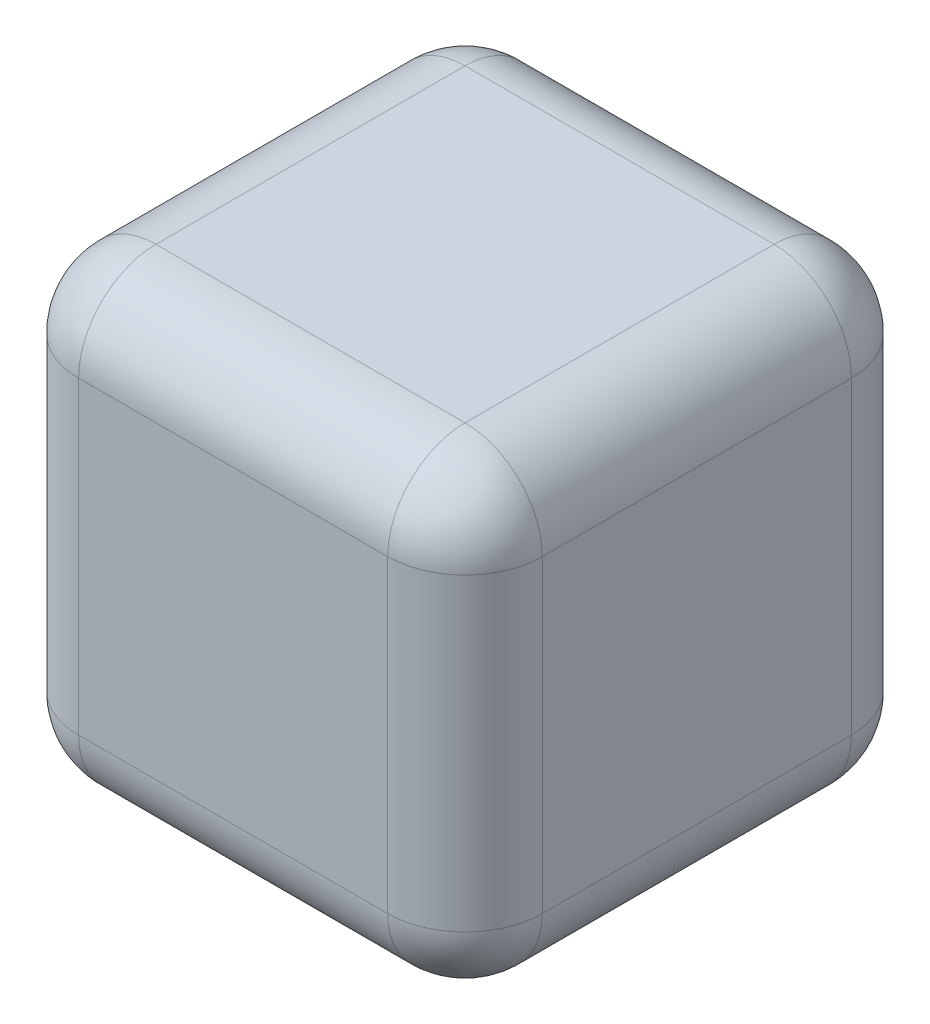
ISO-10303-21;
HEADER;
FILE_DESCRIPTION(('STEP AP214'),'2;1');
FILE_NAME('part.step','',(''),(''),'','','');
FILE_SCHEMA(('AUTOMOTIVE_DESIGN { 1 0 10303 214 1 1 1 1 }'));
ENDSEC;
DATA;
#1=APPLICATION_CONTEXT('core data for automotive mechanical design processes');
#2=APPLICATION_PROTOCOL_DEFINITION('international standard','automotive_design',2000,#1);
#3=PRODUCT_CONTEXT('',#1,'mechanical');
#4=PRODUCT('Part','Part','',(#3));
#5=PRODUCT_RELATED_PRODUCT_CATEGORY('part','',(#4));
#6=PRODUCT_DEFINITION_FORMATION('','',#4);
#7=PRODUCT_DEFINITION_CONTEXT('part definition',#1,'design');
#8=PRODUCT_DEFINITION('design','',#6,#7);
#9=PRODUCT_DEFINITION_SHAPE('','',#8);
#10=(LENGTH_UNIT() NAMED_UNIT(*) SI_UNIT(.MILLI.,.METRE.));
#11=(NAMED_UNIT(*) PLANE_ANGLE_UNIT() SI_UNIT($,.RADIAN.));
#12=(NAMED_UNIT(*) SI_UNIT($,.STERADIAN.) SOLID_ANGLE_UNIT());
#13=UNCERTAINTY_MEASURE_WITH_UNIT(LENGTH_MEASURE(1.E-05),#10,'distance_accuracy_value','');
#14=(GEOMETRIC_REPRESENTATION_CONTEXT(3) GLOBAL_UNCERTAINTY_ASSIGNED_CONTEXT((#13)) GLOBAL_UNIT_ASSIGNED_CONTEXT((#10,
#11,#12)) REPRESENTATION_CONTEXT('',''));
#15=CARTESIAN_POINT('',(0.,0.,0.));
#16=DIRECTION('',(0.,0.,1.));
#17=DIRECTION('',(1.,0.,0.));
#18=AXIS2_PLACEMENT_3D('',#15,#16,#17);
#19=CARTESIAN_POINT('',(-300.,-300.,300.));
#20=DIRECTION('',(-1.,0.,0.));
#21=DIRECTION('',(0.,0.,1.));
#22=AXIS2_PLACEMENT_3D('',#19,#20,#21);
#23=PLANE('',#22);
#24=DIRECTION('',(0.,0.,1.));
#25=VECTOR('',#24,1.);
#26=CARTESIAN_POINT('',(-300.,-200.,300.));
#27=LINE('',#26,#25);
#28=CARTESIAN_POINT('',(-300.,-200.,-200.));
#29=VERTEX_POINT('',#28);
#30=CARTESIAN_POINT('',(-300.,-200.,200.));
#31=VERTEX_POINT('',#30);
#32=EDGE_CURVE('E192',#29,#31,#27,.T.);
#33=ORIENTED_EDGE('',*,*,#32,.T.);
#34=DIRECTION('',(0.,1.,0.));
#35=VECTOR('',#34,1.);
#36=CARTESIAN_POINT('',(-300.,-300.,200.));
#37=LINE('',#36,#35);
#38=CARTESIAN_POINT('',(-300.,200.,200.));
#39=VERTEX_POINT('',#38);
#40=EDGE_CURVE('E195',#31,#39,#37,.T.);
#41=ORIENTED_EDGE('',*,*,#40,.T.);
#42=DIRECTION('',(0.,0.,1.));
#43=VECTOR('',#42,1.);
#44=CARTESIAN_POINT('',(-300.,200.,-300.));
#45=LINE('',#44,#43);
#46=CARTESIAN_POINT('',(-300.,200.,-200.));
#47=VERTEX_POINT('',#46);
#48=EDGE_CURVE('E190',#39,#47,#45,.F.);
#49=ORIENTED_EDGE('',*,*,#48,.T.);
#50=DIRECTION('',(0.,1.,0.));
#51=VECTOR('',#50,1.);
#52=CARTESIAN_POINT('',(-300.,-300.,-200.));
#53=LINE('',#52,#51);
#54=EDGE_CURVE('E188',#47,#29,#53,.F.);
#55=ORIENTED_EDGE('',*,*,#54,.T.);
#56=EDGE_LOOP('',(#33,#41,#49,#55));
#57=FACE_BOUND('',#56,.T.);
#58=ADVANCED_FACE('F37',(#57),#23,.T.);
#59=CARTESIAN_POINT('',(-300.,-300.,-300.));
#60=DIRECTION('',(0.,0.,-1.));
#61=DIRECTION('',(-1.,0.,0.));
#62=AXIS2_PLACEMENT_3D('',#59,#60,#61);
#63=PLANE('',#62);
#64=DIRECTION('',(0.,1.,0.));
#65=VECTOR('',#64,1.);
#66=CARTESIAN_POINT('',(200.,-300.,-300.));
#67=LINE('',#66,#65);
#68=CARTESIAN_POINT('',(200.,200.,-300.));
#69=VERTEX_POINT('',#68);
#70=CARTESIAN_POINT('',(200.,-200.,-300.));
#71=VERTEX_POINT('',#70);
#72=EDGE_CURVE('E46',#69,#71,#67,.F.);
#73=ORIENTED_EDGE('',*,*,#72,.T.);
#74=DIRECTION('',(-1.,0.,0.));
#75=VECTOR('',#74,1.);
#76=CARTESIAN_POINT('',(-300.,-200.,-300.));
#77=LINE('',#76,#75);
#78=CARTESIAN_POINT('',(-200.,-200.,-300.));
#79=VERTEX_POINT('',#78);
#80=EDGE_CURVE('E11',#71,#79,#77,.T.);
#81=ORIENTED_EDGE('',*,*,#80,.T.);
#82=DIRECTION('',(0.,1.,0.));
#83=VECTOR('',#82,1.);
#84=CARTESIAN_POINT('',(-200.,-300.,-300.));
#85=LINE('',#84,#83);
#86=CARTESIAN_POINT('',(-200.,200.,-300.));
#87=VERTEX_POINT('',#86);
#88=EDGE_CURVE('E197',#79,#87,#85,.T.);
#89=ORIENTED_EDGE('',*,*,#88,.T.);
#90=DIRECTION('',(-1.,0.,0.));
#91=VECTOR('',#90,1.);
#92=CARTESIAN_POINT('',(300.,200.,-300.));
#93=LINE('',#92,#91);
#94=EDGE_CURVE('E57',#87,#69,#93,.F.);
#95=ORIENTED_EDGE('',*,*,#94,.T.);
#96=EDGE_LOOP('',(#73,#81,#89,#95));
#97=FACE_BOUND('',#96,.T.);
#98=ADVANCED_FACE('F317',(#97),#63,.T.);
#99=CARTESIAN_POINT('',(300.,-300.,300.));
#100=DIRECTION('',(1.,0.,0.));
#101=DIRECTION('',(0.,0.,-1.));
#102=AXIS2_PLACEMENT_3D('',#99,#100,#101);
#103=PLANE('',#102);
#104=DIRECTION('',(0.,1.,0.));
#105=VECTOR('',#104,1.);
#106=CARTESIAN_POINT('',(300.,-300.,-200.));
#107=LINE('',#106,#105);
#108=CARTESIAN_POINT('',(300.,-200.,-200.));
#109=VERTEX_POINT('',#108);
#110=CARTESIAN_POINT('',(300.,200.,-200.));
#111=VERTEX_POINT('',#110);
#112=EDGE_CURVE('E159',#109,#111,#107,.T.);
#113=ORIENTED_EDGE('',*,*,#112,.T.);
#114=DIRECTION('',(0.,0.,-1.));
#115=VECTOR('',#114,1.);
#116=CARTESIAN_POINT('',(300.,200.,300.));
#117=LINE('',#116,#115);
#118=CARTESIAN_POINT('',(300.,200.,200.));
#119=VERTEX_POINT('',#118);
#120=EDGE_CURVE('E132',#111,#119,#117,.F.);
#121=ORIENTED_EDGE('',*,*,#120,.T.);
#122=DIRECTION('',(0.,1.,0.));
#123=VECTOR('',#122,1.);
#124=CARTESIAN_POINT('',(300.,-300.,200.));
#125=LINE('',#124,#123);
#126=CARTESIAN_POINT('',(300.,-200.,200.));
#127=VERTEX_POINT('',#126);
#128=EDGE_CURVE('E167',#119,#127,#125,.F.);
#129=ORIENTED_EDGE('',*,*,#128,.T.);
#130=DIRECTION('',(0.,0.,-1.));
#131=VECTOR('',#130,1.);
#132=CARTESIAN_POINT('',(300.,-200.,300.));
#133=LINE('',#132,#131);
#134=EDGE_CURVE('E161',#127,#109,#133,.T.);
#135=ORIENTED_EDGE('',*,*,#134,.T.);
#136=EDGE_LOOP('',(#113,#121,#129,#135));
#137=FACE_BOUND('',#136,.T.);
#138=ADVANCED_FACE('F319',(#137),#103,.T.);
#139=CARTESIAN_POINT('',(-300.,-300.,300.));
#140=DIRECTION('',(0.,0.,1.));
#141=DIRECTION('',(1.,0.,0.));
#142=AXIS2_PLACEMENT_3D('',#139,#140,#141);
#143=PLANE('',#142);
#144=DIRECTION('',(0.,1.,0.));
#145=VECTOR('',#144,1.);
#146=CARTESIAN_POINT('',(200.,-300.,300.));
#147=LINE('',#146,#145);
#148=CARTESIAN_POINT('',(200.,-200.,300.));
#149=VERTEX_POINT('',#148);
#150=CARTESIAN_POINT('',(200.,200.,300.));
#151=VERTEX_POINT('',#150);
#152=EDGE_CURVE('E174',#149,#151,#147,.T.);
#153=ORIENTED_EDGE('',*,*,#152,.T.);
#154=DIRECTION('',(1.,0.,0.));
#155=VECTOR('',#154,1.);
#156=CARTESIAN_POINT('',(-300.,200.,300.));
#157=LINE('',#156,#155);
#158=CARTESIAN_POINT('',(-200.,200.,300.));
#159=VERTEX_POINT('',#158);
#160=EDGE_CURVE('E176',#151,#159,#157,.F.);
#161=ORIENTED_EDGE('',*,*,#160,.T.);
#162=DIRECTION('',(0.,1.,0.));
#163=VECTOR('',#162,1.);
#164=CARTESIAN_POINT('',(-200.,-300.,300.));
#165=LINE('',#164,#163);
#166=CARTESIAN_POINT('',(-200.,-200.,300.));
#167=VERTEX_POINT('',#166);
#168=EDGE_CURVE('E170',#159,#167,#165,.F.);
#169=ORIENTED_EDGE('',*,*,#168,.T.);
#170=DIRECTION('',(1.,0.,0.));
#171=VECTOR('',#170,1.);
#172=CARTESIAN_POINT('',(-300.,-200.,300.));
#173=LINE('',#172,#171);
#174=EDGE_CURVE('E172',#167,#149,#173,.T.);
#175=ORIENTED_EDGE('',*,*,#174,.T.);
#176=EDGE_LOOP('',(#153,#161,#169,#175));
#177=FACE_BOUND('',#176,.T.);
#178=ADVANCED_FACE('F290',(#177),#143,.T.);
#179=CARTESIAN_POINT('',(0.,-300.,0.));
#180=DIRECTION('',(0.,-1.,0.));
#181=DIRECTION('',(0.,0.,-1.));
#182=AXIS2_PLACEMENT_3D('',#179,#180,#181);
#183=PLANE('',#182);
#184=DIRECTION('',(0.,0.,-1.));
#185=VECTOR('',#184,1.);
#186=CARTESIAN_POINT('',(200.,-300.,0.));
#187=LINE('',#186,#185);
#188=CARTESIAN_POINT('',(200.,-300.,-200.));
#189=VERTEX_POINT('',#188);
#190=CARTESIAN_POINT('',(200.,-300.,200.));
#191=VERTEX_POINT('',#190);
#192=EDGE_CURVE('E183',#189,#191,#187,.F.);
#193=ORIENTED_EDGE('',*,*,#192,.T.);
#194=DIRECTION('',(1.,0.,0.));
#195=VECTOR('',#194,1.);
#196=CARTESIAN_POINT('',(0.,-300.,200.));
#197=LINE('',#196,#195);
#198=CARTESIAN_POINT('',(-200.,-300.,200.));
#199=VERTEX_POINT('',#198);
#200=EDGE_CURVE('E185',#191,#199,#197,.F.);
#201=ORIENTED_EDGE('',*,*,#200,.T.);
#202=DIRECTION('',(0.,0.,1.));
#203=VECTOR('',#202,1.);
#204=CARTESIAN_POINT('',(-200.,-300.,0.));
#205=LINE('',#204,#203);
#206=CARTESIAN_POINT('',(-200.,-300.,-200.));
#207=VERTEX_POINT('',#206);
#208=EDGE_CURVE('E181',#199,#207,#205,.F.);
#209=ORIENTED_EDGE('',*,*,#208,.T.);
#210=DIRECTION('',(-1.,0.,0.));
#211=VECTOR('',#210,1.);
#212=CARTESIAN_POINT('',(0.,-300.,-200.));
#213=LINE('',#212,#211);
#214=EDGE_CURVE('E179',#207,#189,#213,.F.);
#215=ORIENTED_EDGE('',*,*,#214,.T.);
#216=EDGE_LOOP('',(#193,#201,#209,#215));
#217=FACE_BOUND('',#216,.T.);
#218=ADVANCED_FACE('F269',(#217),#183,.T.);
#219=CARTESIAN_POINT('',(0.,300.,0.));
#220=DIRECTION('',(0.,-1.,0.));
#221=DIRECTION('',(0.,0.,-1.));
#222=AXIS2_PLACEMENT_3D('',#219,#220,#221);
#223=PLANE('',#222);
#224=DIRECTION('',(1.,0.,0.));
#225=VECTOR('',#224,1.);
#226=CARTESIAN_POINT('',(300.,300.,200.));
#227=LINE('',#226,#225);
#228=CARTESIAN_POINT('',(-200.,300.,200.));
#229=VERTEX_POINT('',#228);
#230=CARTESIAN_POINT('',(200.,300.,200.));
#231=VERTEX_POINT('',#230);
#232=EDGE_CURVE('E157',#229,#231,#227,.T.);
#233=ORIENTED_EDGE('',*,*,#232,.T.);
#234=DIRECTION('',(0.,0.,-1.));
#235=VECTOR('',#234,1.);
#236=CARTESIAN_POINT('',(200.,300.,-300.));
#237=LINE('',#236,#235);
#238=CARTESIAN_POINT('',(200.,300.,-200.));
#239=VERTEX_POINT('',#238);
#240=EDGE_CURVE('E130',#231,#239,#237,.T.);
#241=ORIENTED_EDGE('',*,*,#240,.T.);
#242=DIRECTION('',(-1.,0.,0.));
#243=VECTOR('',#242,1.);
#244=CARTESIAN_POINT('',(-300.,300.,-200.));
#245=LINE('',#244,#243);
#246=CARTESIAN_POINT('',(-200.,300.,-200.));
#247=VERTEX_POINT('',#246);
#248=EDGE_CURVE('E147',#239,#247,#245,.T.);
#249=ORIENTED_EDGE('',*,*,#248,.T.);
#250=DIRECTION('',(0.,0.,1.));
#251=VECTOR('',#250,1.);
#252=CARTESIAN_POINT('',(-200.,300.,300.));
#253=LINE('',#252,#251);
#254=EDGE_CURVE('E153',#247,#229,#253,.T.);
#255=ORIENTED_EDGE('',*,*,#254,.T.);
#256=EDGE_LOOP('',(#233,#241,#249,#255));
#257=FACE_BOUND('',#256,.T.);
#258=ADVANCED_FACE('F155',(#257),#223,.F.);
#259=CARTESIAN_POINT('',(-200.,-200.,300.));
#260=DIRECTION('',(0.,0.,1.));
#261=DIRECTION('',(1.,0.,0.));
#262=AXIS2_PLACEMENT_3D('',#259,#260,#261);
#263=CYLINDRICAL_SURFACE('',#262,100.);
#264=CARTESIAN_POINT('',(-200.,-200.,200.));
#265=DIRECTION('',(0.,0.,1.));
#266=DIRECTION('',(1.,0.,0.));
#267=AXIS2_PLACEMENT_3D('',#264,#265,#266);
#268=CIRCLE('',#267,100.);
#269=EDGE_CURVE('E41',#31,#199,#268,.T.);
#270=ORIENTED_EDGE('',*,*,#269,.F.);
#271=ORIENTED_EDGE('',*,*,#32,.F.);
#272=CARTESIAN_POINT('',(-200.,-200.,-200.));
#273=DIRECTION('',(0.,0.,-1.));
#274=DIRECTION('',(-1.,0.,0.));
#275=AXIS2_PLACEMENT_3D('',#272,#273,#274);
#276=CIRCLE('',#275,100.);
#277=EDGE_CURVE('E251',#207,#29,#276,.T.);
#278=ORIENTED_EDGE('',*,*,#277,.F.);
#279=ORIENTED_EDGE('',*,*,#208,.F.);
#280=EDGE_LOOP('',(#270,#271,#278,#279));
#281=FACE_BOUND('',#280,.T.);
#282=ADVANCED_FACE('F39',(#281),#263,.T.);
#283=CARTESIAN_POINT('',(-200.,-200.,200.));
#284=DIRECTION('',(0.,0.,1.));
#285=DIRECTION('',(1.,0.,0.));
#286=AXIS2_PLACEMENT_3D('',#283,#284,#285);
#287=SPHERICAL_SURFACE('',#286,100.);
#288=CARTESIAN_POINT('',(-200.,-200.,200.));
#289=DIRECTION('',(0.,-1.,0.));
#290=DIRECTION('',(0.,0.,-1.));
#291=AXIS2_PLACEMENT_3D('',#288,#289,#290);
#292=CIRCLE('',#291,100.);
#293=EDGE_CURVE('E247',#31,#167,#292,.F.);
#294=ORIENTED_EDGE('',*,*,#293,.F.);
#295=ORIENTED_EDGE('',*,*,#269,.T.);
#296=CARTESIAN_POINT('',(-200.,-200.,200.));
#297=DIRECTION('',(-1.,0.,0.));
#298=DIRECTION('',(0.,0.,1.));
#299=AXIS2_PLACEMENT_3D('',#296,#297,#298);
#300=CIRCLE('',#299,100.);
#301=EDGE_CURVE('E250',#167,#199,#300,.F.);
#302=ORIENTED_EDGE('',*,*,#301,.F.);
#303=EDGE_LOOP('',(#294,#295,#302));
#304=FACE_BOUND('',#303,.T.);
#305=ADVANCED_FACE('F263',(#304),#287,.T.);
#306=CARTESIAN_POINT('',(-200.,-200.,-200.));
#307=DIRECTION('',(0.,0.,1.));
#308=DIRECTION('',(1.,0.,0.));
#309=AXIS2_PLACEMENT_3D('',#306,#307,#308);
#310=SPHERICAL_SURFACE('',#309,100.);
#311=CARTESIAN_POINT('',(-200.,-200.,-200.));
#312=DIRECTION('',(-1.,0.,0.));
#313=DIRECTION('',(0.,0.,1.));
#314=AXIS2_PLACEMENT_3D('',#311,#312,#313);
#315=CIRCLE('',#314,100.);
#316=EDGE_CURVE('E241',#207,#79,#315,.F.);
#317=ORIENTED_EDGE('',*,*,#316,.F.);
#318=ORIENTED_EDGE('',*,*,#277,.T.);
#319=CARTESIAN_POINT('',(-200.,-200.,-200.));
#320=DIRECTION('',(0.,-1.,0.));
#321=DIRECTION('',(0.,0.,-1.));
#322=AXIS2_PLACEMENT_3D('',#319,#320,#321);
#323=CIRCLE('',#322,100.);
#324=EDGE_CURVE('E244',#79,#29,#323,.F.);
#325=ORIENTED_EDGE('',*,*,#324,.F.);
#326=EDGE_LOOP('',(#317,#318,#325));
#327=FACE_BOUND('',#326,.T.);
#328=ADVANCED_FACE('F313',(#327),#310,.T.);
#329=CARTESIAN_POINT('',(-300.,-200.,200.));
#330=DIRECTION('',(1.,0.,0.));
#331=DIRECTION('',(0.,0.,-1.));
#332=AXIS2_PLACEMENT_3D('',#329,#330,#331);
#333=CYLINDRICAL_SURFACE('',#332,100.);
#334=ORIENTED_EDGE('',*,*,#301,.T.);
#335=ORIENTED_EDGE('',*,*,#200,.F.);
#336=CARTESIAN_POINT('',(200.,-200.,200.));
#337=DIRECTION('',(1.,0.,0.));
#338=DIRECTION('',(0.,1.,0.));
#339=AXIS2_PLACEMENT_3D('',#336,#337,#338);
#340=CIRCLE('',#339,100.);
#341=EDGE_CURVE('E235',#149,#191,#340,.T.);
#342=ORIENTED_EDGE('',*,*,#341,.F.);
#343=ORIENTED_EDGE('',*,*,#174,.F.);
#344=EDGE_LOOP('',(#334,#335,#342,#343));
#345=FACE_BOUND('',#344,.T.);
#346=ADVANCED_FACE('F274',(#345),#333,.T.);
#347=CARTESIAN_POINT('',(-200.,-300.,200.));
#348=DIRECTION('',(0.,1.,0.));
#349=DIRECTION('',(0.,0.,1.));
#350=AXIS2_PLACEMENT_3D('',#347,#348,#349);
#351=CYLINDRICAL_SURFACE('',#350,100.);
#352=ORIENTED_EDGE('',*,*,#293,.T.);
#353=ORIENTED_EDGE('',*,*,#168,.F.);
#354=CARTESIAN_POINT('',(-200.,200.,200.));
#355=DIRECTION('',(0.,1.,0.));
#356=DIRECTION('',(0.,0.,1.));
#357=AXIS2_PLACEMENT_3D('',#354,#355,#356);
#358=CIRCLE('',#357,100.);
#359=EDGE_CURVE('E232',#39,#159,#358,.T.);
#360=ORIENTED_EDGE('',*,*,#359,.F.);
#361=ORIENTED_EDGE('',*,*,#40,.F.);
#362=EDGE_LOOP('',(#352,#353,#360,#361));
#363=FACE_BOUND('',#362,.T.);
#364=ADVANCED_FACE('F301',(#363),#351,.T.);
#365=CARTESIAN_POINT('',(-200.,200.,0.));
#366=DIRECTION('',(0.,0.,-1.));
#367=DIRECTION('',(-1.,0.,0.));
#368=AXIS2_PLACEMENT_3D('',#365,#366,#367);
#369=CYLINDRICAL_SURFACE('',#368,100.);
#370=CARTESIAN_POINT('',(-200.,200.,-200.));
#371=DIRECTION('',(0.,0.,-1.));
#372=DIRECTION('',(-1.,0.,0.));
#373=AXIS2_PLACEMENT_3D('',#370,#371,#372);
#374=CIRCLE('',#373,100.);
#375=EDGE_CURVE('E226',#47,#247,#374,.T.);
#376=ORIENTED_EDGE('',*,*,#375,.F.);
#377=ORIENTED_EDGE('',*,*,#48,.F.);
#378=CARTESIAN_POINT('',(-200.,200.,200.));
#379=DIRECTION('',(0.,0.,1.));
#380=DIRECTION('',(1.,0.,0.));
#381=AXIS2_PLACEMENT_3D('',#378,#379,#380);
#382=CIRCLE('',#381,100.);
#383=EDGE_CURVE('E229',#229,#39,#382,.T.);
#384=ORIENTED_EDGE('',*,*,#383,.F.);
#385=ORIENTED_EDGE('',*,*,#254,.F.);
#386=EDGE_LOOP('',(#376,#377,#384,#385));
#387=FACE_BOUND('',#386,.T.);
#388=ADVANCED_FACE('F307',(#387),#369,.T.);
#389=CARTESIAN_POINT('',(-200.,-300.,-200.));
#390=DIRECTION('',(0.,1.,0.));
#391=DIRECTION('',(0.,0.,1.));
#392=AXIS2_PLACEMENT_3D('',#389,#390,#391);
#393=CYLINDRICAL_SURFACE('',#392,100.);
#394=ORIENTED_EDGE('',*,*,#324,.T.);
#395=ORIENTED_EDGE('',*,*,#54,.F.);
#396=CARTESIAN_POINT('',(-200.,200.,-200.));
#397=DIRECTION('',(0.,1.,0.));
#398=DIRECTION('',(0.,0.,1.));
#399=AXIS2_PLACEMENT_3D('',#396,#397,#398);
#400=CIRCLE('',#399,100.);
#401=EDGE_CURVE('E223',#87,#47,#400,.T.);
#402=ORIENTED_EDGE('',*,*,#401,.F.);
#403=ORIENTED_EDGE('',*,*,#88,.F.);
#404=EDGE_LOOP('',(#394,#395,#402,#403));
#405=FACE_BOUND('',#404,.T.);
#406=ADVANCED_FACE('F312',(#405),#393,.T.);
#407=CARTESIAN_POINT('',(-300.,-200.,-200.));
#408=DIRECTION('',(-1.,0.,0.));
#409=DIRECTION('',(0.,0.,1.));
#410=AXIS2_PLACEMENT_3D('',#407,#408,#409);
#411=CYLINDRICAL_SURFACE('',#410,100.);
#412=ORIENTED_EDGE('',*,*,#316,.T.);
#413=ORIENTED_EDGE('',*,*,#80,.F.);
#414=CARTESIAN_POINT('',(200.,-200.,-200.));
#415=DIRECTION('',(1.,0.,0.));
#416=DIRECTION('',(0.,0.,-1.));
#417=AXIS2_PLACEMENT_3D('',#414,#415,#416);
#418=CIRCLE('',#417,100.);
#419=EDGE_CURVE('E220',#189,#71,#418,.T.);
#420=ORIENTED_EDGE('',*,*,#419,.F.);
#421=ORIENTED_EDGE('',*,*,#214,.F.);
#422=EDGE_LOOP('',(#412,#413,#420,#421));
#423=FACE_BOUND('',#422,.T.);
#424=ADVANCED_FACE('F316',(#423),#411,.T.);
#425=CARTESIAN_POINT('',(200.,-200.,300.));
#426=DIRECTION('',(0.,0.,-1.));
#427=DIRECTION('',(-1.,0.,0.));
#428=AXIS2_PLACEMENT_3D('',#425,#426,#427);
#429=CYLINDRICAL_SURFACE('',#428,100.);
#430=CARTESIAN_POINT('',(200.,-200.,200.));
#431=DIRECTION('',(0.,0.,1.));
#432=DIRECTION('',(1.,0.,0.));
#433=AXIS2_PLACEMENT_3D('',#430,#431,#432);
#434=CIRCLE('',#433,100.);
#435=EDGE_CURVE('E238',#191,#127,#434,.T.);
#436=ORIENTED_EDGE('',*,*,#435,.F.);
#437=ORIENTED_EDGE('',*,*,#192,.F.);
#438=CARTESIAN_POINT('',(200.,-200.,-200.));
#439=DIRECTION('',(0.,0.,-1.));
#440=DIRECTION('',(0.,1.,0.));
#441=AXIS2_PLACEMENT_3D('',#438,#439,#440);
#442=CIRCLE('',#441,100.);
#443=EDGE_CURVE('E217',#109,#189,#442,.T.);
#444=ORIENTED_EDGE('',*,*,#443,.F.);
#445=ORIENTED_EDGE('',*,*,#134,.F.);
#446=EDGE_LOOP('',(#436,#437,#444,#445));
#447=FACE_BOUND('',#446,.T.);
#448=ADVANCED_FACE('F278',(#447),#429,.T.);
#449=CARTESIAN_POINT('',(200.,-200.,200.));
#450=DIRECTION('',(0.,0.,1.));
#451=DIRECTION('',(1.,0.,0.));
#452=AXIS2_PLACEMENT_3D('',#449,#450,#451);
#453=SPHERICAL_SURFACE('',#452,100.);
#454=ORIENTED_EDGE('',*,*,#341,.T.);
#455=ORIENTED_EDGE('',*,*,#435,.T.);
#456=CARTESIAN_POINT('',(200.,-200.,200.));
#457=DIRECTION('',(0.,-1.,0.));
#458=DIRECTION('',(0.,0.,-1.));
#459=AXIS2_PLACEMENT_3D('',#456,#457,#458);
#460=CIRCLE('',#459,100.);
#461=EDGE_CURVE('E214',#149,#127,#460,.F.);
#462=ORIENTED_EDGE('',*,*,#461,.F.);
#463=EDGE_LOOP('',(#454,#455,#462));
#464=FACE_BOUND('',#463,.T.);
#465=ADVANCED_FACE('F282',(#464),#453,.T.);
#466=CARTESIAN_POINT('',(-200.,200.,200.));
#467=DIRECTION('',(0.,0.,1.));
#468=DIRECTION('',(1.,0.,0.));
#469=AXIS2_PLACEMENT_3D('',#466,#467,#468);
#470=SPHERICAL_SURFACE('',#469,100.);
#471=ORIENTED_EDGE('',*,*,#383,.T.);
#472=ORIENTED_EDGE('',*,*,#359,.T.);
#473=CARTESIAN_POINT('',(-200.,200.,200.));
#474=DIRECTION('',(-1.,0.,0.));
#475=DIRECTION('',(0.,0.,1.));
#476=AXIS2_PLACEMENT_3D('',#473,#474,#475);
#477=CIRCLE('',#476,100.);
#478=EDGE_CURVE('E212',#229,#159,#477,.F.);
#479=ORIENTED_EDGE('',*,*,#478,.F.);
#480=EDGE_LOOP('',(#471,#472,#479));
#481=FACE_BOUND('',#480,.T.);
#482=ADVANCED_FACE('F298',(#481),#470,.T.);
#483=CARTESIAN_POINT('',(-200.,200.,-200.));
#484=DIRECTION('',(0.,0.,1.));
#485=DIRECTION('',(1.,0.,0.));
#486=AXIS2_PLACEMENT_3D('',#483,#484,#485);
#487=SPHERICAL_SURFACE('',#486,100.);
#488=ORIENTED_EDGE('',*,*,#401,.T.);
#489=ORIENTED_EDGE('',*,*,#375,.T.);
#490=CARTESIAN_POINT('',(-200.,200.,-200.));
#491=DIRECTION('',(-1.,0.,0.));
#492=DIRECTION('',(0.,0.,1.));
#493=AXIS2_PLACEMENT_3D('',#490,#491,#492);
#494=CIRCLE('',#493,100.);
#495=EDGE_CURVE('E150',#87,#247,#494,.F.);
#496=ORIENTED_EDGE('',*,*,#495,.F.);
#497=EDGE_LOOP('',(#488,#489,#496));
#498=FACE_BOUND('',#497,.T.);
#499=ADVANCED_FACE('F310',(#498),#487,.T.);
#500=CARTESIAN_POINT('',(200.,-200.,-200.));
#501=DIRECTION('',(0.,0.,1.));
#502=DIRECTION('',(1.,0.,0.));
#503=AXIS2_PLACEMENT_3D('',#500,#501,#502);
#504=SPHERICAL_SURFACE('',#503,100.);
#505=ORIENTED_EDGE('',*,*,#443,.T.);
#506=ORIENTED_EDGE('',*,*,#419,.T.);
#507=CARTESIAN_POINT('',(200.,-200.,-200.));
#508=DIRECTION('',(0.,-1.,0.));
#509=DIRECTION('',(0.,0.,-1.));
#510=AXIS2_PLACEMENT_3D('',#507,#508,#509);
#511=CIRCLE('',#510,100.);
#512=EDGE_CURVE('E208',#109,#71,#511,.F.);
#513=ORIENTED_EDGE('',*,*,#512,.F.);
#514=EDGE_LOOP('',(#505,#506,#513));
#515=FACE_BOUND('',#514,.T.);
#516=ADVANCED_FACE('F351',(#515),#504,.T.);
#517=CARTESIAN_POINT('',(200.,-300.,200.));
#518=DIRECTION('',(0.,1.,0.));
#519=DIRECTION('',(0.,0.,1.));
#520=AXIS2_PLACEMENT_3D('',#517,#518,#519);
#521=CYLINDRICAL_SURFACE('',#520,100.);
#522=ORIENTED_EDGE('',*,*,#461,.T.);
#523=ORIENTED_EDGE('',*,*,#128,.F.);
#524=CARTESIAN_POINT('',(200.,200.,200.));
#525=DIRECTION('',(0.,1.,0.));
#526=DIRECTION('',(0.,0.,1.));
#527=AXIS2_PLACEMENT_3D('',#524,#525,#526);
#528=CIRCLE('',#527,100.);
#529=EDGE_CURVE('E205',#151,#119,#528,.T.);
#530=ORIENTED_EDGE('',*,*,#529,.F.);
#531=ORIENTED_EDGE('',*,*,#152,.F.);
#532=EDGE_LOOP('',(#522,#523,#530,#531));
#533=FACE_BOUND('',#532,.T.);
#534=ADVANCED_FACE('F287',(#533),#521,.T.);
#535=CARTESIAN_POINT('',(0.,200.,200.));
#536=DIRECTION('',(-1.,0.,0.));
#537=DIRECTION('',(0.,0.,1.));
#538=AXIS2_PLACEMENT_3D('',#535,#536,#537);
#539=CYLINDRICAL_SURFACE('',#538,100.);
#540=ORIENTED_EDGE('',*,*,#478,.T.);
#541=ORIENTED_EDGE('',*,*,#160,.F.);
#542=CARTESIAN_POINT('',(200.,200.,200.));
#543=DIRECTION('',(1.,0.,0.));
#544=DIRECTION('',(0.,0.,-1.));
#545=AXIS2_PLACEMENT_3D('',#542,#543,#544);
#546=CIRCLE('',#545,100.);
#547=EDGE_CURVE('E144',#231,#151,#546,.T.);
#548=ORIENTED_EDGE('',*,*,#547,.F.);
#549=ORIENTED_EDGE('',*,*,#232,.F.);
#550=EDGE_LOOP('',(#540,#541,#548,#549));
#551=FACE_BOUND('',#550,.T.);
#552=ADVANCED_FACE('F292',(#551),#539,.T.);
#553=CARTESIAN_POINT('',(0.,200.,-200.));
#554=DIRECTION('',(1.,0.,0.));
#555=DIRECTION('',(0.,0.,-1.));
#556=AXIS2_PLACEMENT_3D('',#553,#554,#555);
#557=CYLINDRICAL_SURFACE('',#556,100.);
#558=ORIENTED_EDGE('',*,*,#495,.T.);
#559=ORIENTED_EDGE('',*,*,#248,.F.);
#560=CARTESIAN_POINT('',(200.,200.,-200.));
#561=DIRECTION('',(1.,0.,0.));
#562=DIRECTION('',(0.,0.,-1.));
#563=AXIS2_PLACEMENT_3D('',#560,#561,#562);
#564=CIRCLE('',#563,100.);
#565=EDGE_CURVE('E138',#69,#239,#564,.T.);
#566=ORIENTED_EDGE('',*,*,#565,.F.);
#567=ORIENTED_EDGE('',*,*,#94,.F.);
#568=EDGE_LOOP('',(#558,#559,#566,#567));
#569=FACE_BOUND('',#568,.T.);
#570=ADVANCED_FACE('F148',(#569),#557,.T.);
#571=CARTESIAN_POINT('',(200.,-300.,-200.));
#572=DIRECTION('',(0.,1.,0.));
#573=DIRECTION('',(0.,0.,1.));
#574=AXIS2_PLACEMENT_3D('',#571,#572,#573);
#575=CYLINDRICAL_SURFACE('',#574,100.);
#576=ORIENTED_EDGE('',*,*,#512,.T.);
#577=ORIENTED_EDGE('',*,*,#72,.F.);
#578=CARTESIAN_POINT('',(200.,200.,-200.));
#579=DIRECTION('',(0.,1.,0.));
#580=DIRECTION('',(0.,0.,1.));
#581=AXIS2_PLACEMENT_3D('',#578,#579,#580);
#582=CIRCLE('',#581,100.);
#583=EDGE_CURVE('E142',#111,#69,#582,.T.);
#584=ORIENTED_EDGE('',*,*,#583,.F.);
#585=ORIENTED_EDGE('',*,*,#112,.F.);
#586=EDGE_LOOP('',(#576,#577,#584,#585));
#587=FACE_BOUND('',#586,.T.);
#588=ADVANCED_FACE('F340',(#587),#575,.T.);
#589=CARTESIAN_POINT('',(200.,200.,200.));
#590=DIRECTION('',(0.,0.,1.));
#591=DIRECTION('',(1.,0.,0.));
#592=AXIS2_PLACEMENT_3D('',#589,#590,#591);
#593=SPHERICAL_SURFACE('',#592,100.);
#594=ORIENTED_EDGE('',*,*,#547,.T.);
#595=ORIENTED_EDGE('',*,*,#529,.T.);
#596=CARTESIAN_POINT('',(200.,200.,200.));
#597=DIRECTION('',(0.,0.,1.));
#598=DIRECTION('',(1.,0.,0.));
#599=AXIS2_PLACEMENT_3D('',#596,#597,#598);
#600=CIRCLE('',#599,100.);
#601=EDGE_CURVE('E135',#231,#119,#600,.F.);
#602=ORIENTED_EDGE('',*,*,#601,.F.);
#603=EDGE_LOOP('',(#594,#595,#602));
#604=FACE_BOUND('',#603,.T.);
#605=ADVANCED_FACE('F337',(#604),#593,.T.);
#606=CARTESIAN_POINT('',(200.,200.,-200.));
#607=DIRECTION('',(0.,0.,1.));
#608=DIRECTION('',(1.,0.,0.));
#609=AXIS2_PLACEMENT_3D('',#606,#607,#608);
#610=SPHERICAL_SURFACE('',#609,100.);
#611=ORIENTED_EDGE('',*,*,#583,.T.);
#612=ORIENTED_EDGE('',*,*,#565,.T.);
#613=CARTESIAN_POINT('',(200.,200.,-200.));
#614=DIRECTION('',(0.,0.,-1.));
#615=DIRECTION('',(-1.,0.,0.));
#616=AXIS2_PLACEMENT_3D('',#613,#614,#615);
#617=CIRCLE('',#616,100.);
#618=EDGE_CURVE('E126',#111,#239,#617,.F.);
#619=ORIENTED_EDGE('',*,*,#618,.F.);
#620=EDGE_LOOP('',(#611,#612,#619));
#621=FACE_BOUND('',#620,.T.);
#622=ADVANCED_FACE('F140',(#621),#610,.T.);
#623=CARTESIAN_POINT('',(200.,200.,0.));
#624=DIRECTION('',(0.,0.,1.));
#625=DIRECTION('',(1.,0.,0.));
#626=AXIS2_PLACEMENT_3D('',#623,#624,#625);
#627=CYLINDRICAL_SURFACE('',#626,100.);
#628=ORIENTED_EDGE('',*,*,#601,.T.);
#629=ORIENTED_EDGE('',*,*,#120,.F.);
#630=ORIENTED_EDGE('',*,*,#618,.T.);
#631=ORIENTED_EDGE('',*,*,#240,.F.);
#632=EDGE_LOOP('',(#628,#629,#630,#631));
#633=FACE_BOUND('',#632,.T.);
#634=ADVANCED_FACE('F128',(#633),#627,.T.);
#635=CLOSED_SHELL('',(#58,#98,#138,#178,#218,#258,#282,#305,#328,#346,#364,#388,#406,#424,#448,
#465,#482,#499,#516,#534,#552,#570,#588,#605,#622,#634));
#636=MANIFOLD_SOLID_BREP('B2',#635);
#637=ADVANCED_BREP_SHAPE_REPRESENTATION('',(#18,#636),#14);
#638=SHAPE_DEFINITION_REPRESENTATION(#9,#637);
ENDSEC;
END-ISO-10303-21;
